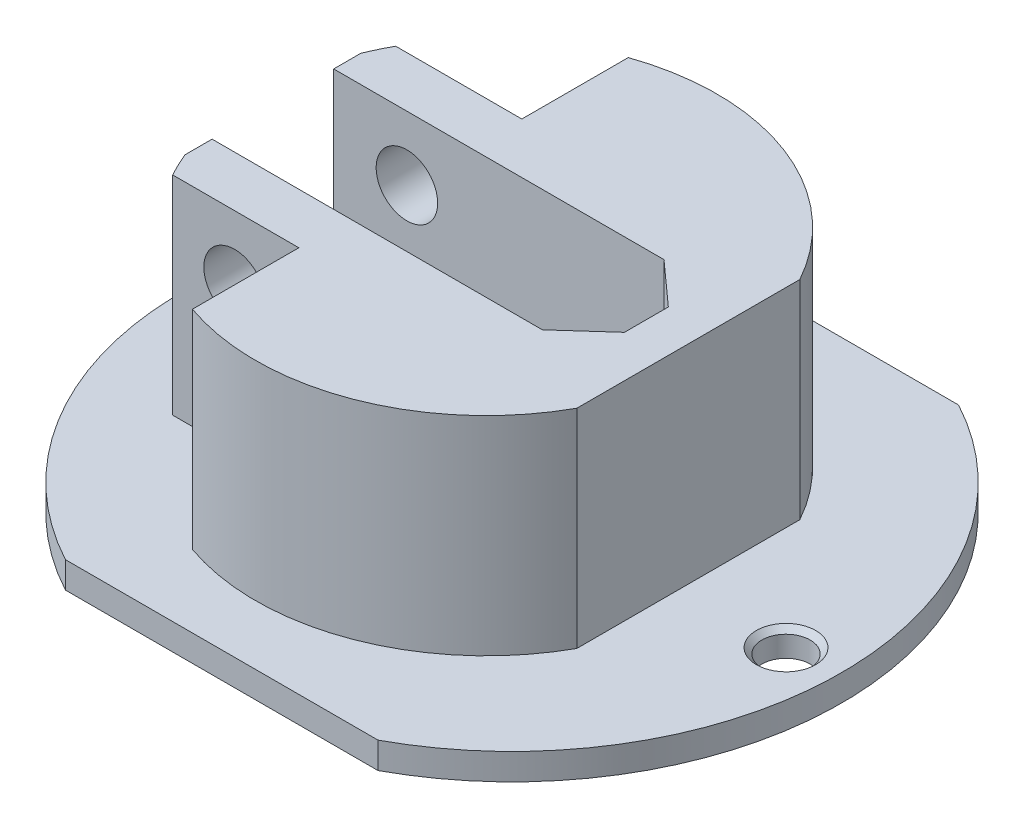
ISO-10303-21;
HEADER;
FILE_DESCRIPTION(('STEP AP214'),'2;1');
FILE_NAME('part.step','',(''),(''),'','','');
FILE_SCHEMA(('AUTOMOTIVE_DESIGN { 1 0 10303 214 1 1 1 1 }'));
ENDSEC;
DATA;
#1=APPLICATION_CONTEXT('core data for automotive mechanical design processes');
#2=APPLICATION_PROTOCOL_DEFINITION('international standard','automotive_design',2000,#1);
#3=PRODUCT_CONTEXT('',#1,'mechanical');
#4=PRODUCT('Part','Part','',(#3));
#5=PRODUCT_RELATED_PRODUCT_CATEGORY('part','',(#4));
#6=PRODUCT_DEFINITION_FORMATION('','',#4);
#7=PRODUCT_DEFINITION_CONTEXT('part definition',#1,'design');
#8=PRODUCT_DEFINITION('design','',#6,#7);
#9=PRODUCT_DEFINITION_SHAPE('','',#8);
#10=(LENGTH_UNIT() NAMED_UNIT(*) SI_UNIT(.MILLI.,.METRE.));
#11=(NAMED_UNIT(*) PLANE_ANGLE_UNIT() SI_UNIT($,.RADIAN.));
#12=(NAMED_UNIT(*) SI_UNIT($,.STERADIAN.) SOLID_ANGLE_UNIT());
#13=UNCERTAINTY_MEASURE_WITH_UNIT(LENGTH_MEASURE(1.E-05),#10,'distance_accuracy_value','');
#14=(GEOMETRIC_REPRESENTATION_CONTEXT(3) GLOBAL_UNCERTAINTY_ASSIGNED_CONTEXT((#13)) GLOBAL_UNIT_ASSIGNED_CONTEXT((#10,
#11,#12)) REPRESENTATION_CONTEXT('',''));
#15=CARTESIAN_POINT('',(0.,0.,0.));
#16=DIRECTION('',(0.,0.,1.));
#17=DIRECTION('',(1.,0.,0.));
#18=AXIS2_PLACEMENT_3D('',#15,#16,#17);
#19=CARTESIAN_POINT('',(7.74345813862928,16.,4.1));
#20=DIRECTION('',(0.,-1.,0.));
#21=DIRECTION('',(0.,0.,-1.));
#22=AXIS2_PLACEMENT_3D('',#19,#20,#21);
#23=CYLINDRICAL_SURFACE('',#22,15.75);
#24=DIRECTION('',(0.,-1.,0.));
#25=VECTOR('',#24,1.);
#26=CARTESIAN_POINT('',(21.5330945154003,16.,-3.50975877386623));
#27=LINE('',#26,#25);
#28=CARTESIAN_POINT('',(21.5330945154003,16.,-3.50975877386623));
#29=VERTEX_POINT('',#28);
#30=CARTESIAN_POINT('',(21.5330945154003,1.8,-3.50975877386623));
#31=VERTEX_POINT('',#30);
#32=EDGE_CURVE('E281',#29,#31,#27,.T.);
#33=ORIENTED_EDGE('',*,*,#32,.T.);
#34=CARTESIAN_POINT('',(7.74345813862928,1.8,4.1));
#35=DIRECTION('',(0.,1.,0.));
#36=DIRECTION('',(0.,0.,1.));
#37=AXIS2_PLACEMENT_3D('',#34,#35,#36);
#38=CIRCLE('',#37,15.75);
#39=CARTESIAN_POINT('',(2.5617476099898,1.8,-10.7732100098596));
#40=VERTEX_POINT('',#39);
#41=EDGE_CURVE('E60',#31,#40,#38,.T.);
#42=ORIENTED_EDGE('',*,*,#41,.T.);
#43=DIRECTION('',(0.,-1.,0.));
#44=VECTOR('',#43,1.);
#45=CARTESIAN_POINT('',(2.5617476099898,16.,-10.7732100098596));
#46=LINE('',#45,#44);
#47=CARTESIAN_POINT('',(2.5617476099898,16.,-10.7732100098596));
#48=VERTEX_POINT('',#47);
#49=EDGE_CURVE('E45',#48,#40,#46,.T.);
#50=ORIENTED_EDGE('',*,*,#49,.F.);
#51=CARTESIAN_POINT('',(7.74345813862928,16.,4.1));
#52=DIRECTION('',(0.,1.,0.));
#53=DIRECTION('',(0.,0.,1.));
#54=AXIS2_PLACEMENT_3D('',#51,#52,#53);
#55=CIRCLE('',#54,15.75);
#56=EDGE_CURVE('E244',#29,#48,#55,.T.);
#57=ORIENTED_EDGE('',*,*,#56,.F.);
#58=EDGE_LOOP('',(#33,#42,#50,#57));
#59=FACE_BOUND('',#58,.T.);
#60=ADVANCED_FACE('F37',(#59),#23,.T.);
#61=CARTESIAN_POINT('',(2.5617476099898,16.,-3.50975877386623));
#62=DIRECTION('',(1.,0.,0.));
#63=DIRECTION('',(0.,0.,-1.));
#64=AXIS2_PLACEMENT_3D('',#61,#62,#63);
#65=PLANE('',#64);
#66=ORIENTED_EDGE('',*,*,#49,.T.);
#67=DIRECTION('',(0.,0.,1.));
#68=VECTOR('',#67,1.);
#69=CARTESIAN_POINT('',(2.5617476099898,1.8,-3.50975877386623));
#70=LINE('',#69,#68);
#71=CARTESIAN_POINT('',(2.5617476099898,1.8,-3.50975877386623));
#72=VERTEX_POINT('',#71);
#73=EDGE_CURVE('E240',#40,#72,#70,.T.);
#74=ORIENTED_EDGE('',*,*,#73,.T.);
#75=DIRECTION('',(0.,-1.,0.));
#76=VECTOR('',#75,1.);
#77=CARTESIAN_POINT('',(2.5617476099898,16.,-3.50975877386623));
#78=LINE('',#77,#76);
#79=CARTESIAN_POINT('',(2.5617476099898,16.,-3.50975877386623));
#80=VERTEX_POINT('',#79);
#81=EDGE_CURVE('E321',#80,#72,#78,.T.);
#82=ORIENTED_EDGE('',*,*,#81,.F.);
#83=DIRECTION('',(0.,0.,1.));
#84=VECTOR('',#83,1.);
#85=CARTESIAN_POINT('',(2.5617476099898,16.,-9.29598357707961));
#86=LINE('',#85,#84);
#87=EDGE_CURVE('E247',#48,#80,#86,.T.);
#88=ORIENTED_EDGE('',*,*,#87,.F.);
#89=EDGE_LOOP('',(#66,#74,#82,#88));
#90=FACE_BOUND('',#89,.T.);
#91=ADVANCED_FACE('F327',(#90),#65,.F.);
#92=CARTESIAN_POINT('',(-4.4382523900102,16.,-3.50975877386623));
#93=DIRECTION('',(0.,0.,1.));
#94=DIRECTION('',(1.,0.,0.));
#95=AXIS2_PLACEMENT_3D('',#92,#93,#94);
#96=PLANE('',#95);
#97=CARTESIAN_POINT('',(-1.82378765132546,11.6161721166661,-3.50975877386623));
#98=DIRECTION('',(0.,0.,1.));
#99=DIRECTION('',(1.,0.,0.));
#100=AXIS2_PLACEMENT_3D('',#97,#98,#99);
#101=CIRCLE('',#100,2.09999999999999);
#102=CARTESIAN_POINT('',(0.276212348674535,11.6161721166661,-3.50975877386623));
#103=VERTEX_POINT('',#102);
#104=EDGE_CURVE('E404',#103,#103,#101,.T.);
#105=ORIENTED_EDGE('',*,*,#104,.T.);
#106=EDGE_LOOP('',(#105));
#107=FACE_BOUND('',#106,.T.);
#108=ORIENTED_EDGE('',*,*,#81,.T.);
#109=DIRECTION('',(-1.,0.,0.));
#110=VECTOR('',#109,1.);
#111=CARTESIAN_POINT('',(-4.4382523900102,1.8,-3.50975877386623));
#112=LINE('',#111,#110);
#113=CARTESIAN_POINT('',(-6.04617823814172,1.8,-3.50975877386623));
#114=VERTEX_POINT('',#113);
#115=EDGE_CURVE('E237',#72,#114,#112,.T.);
#116=ORIENTED_EDGE('',*,*,#115,.T.);
#117=DIRECTION('',(0.,-1.,0.));
#118=VECTOR('',#117,1.);
#119=CARTESIAN_POINT('',(-6.04617823814172,16.,-3.50975877386623));
#120=LINE('',#119,#118);
#121=CARTESIAN_POINT('',(-6.04617823814172,16.,-3.50975877386623));
#122=VERTEX_POINT('',#121);
#123=EDGE_CURVE('E318',#122,#114,#120,.T.);
#124=ORIENTED_EDGE('',*,*,#123,.F.);
#125=DIRECTION('',(-1.,0.,0.));
#126=VECTOR('',#125,1.);
#127=CARTESIAN_POINT('',(2.5617476099898,16.,-3.50975877386623));
#128=LINE('',#127,#126);
#129=EDGE_CURVE('E249',#80,#122,#128,.T.);
#130=ORIENTED_EDGE('',*,*,#129,.F.);
#131=EDGE_LOOP('',(#108,#116,#124,#130));
#132=FACE_BOUND('',#131,.T.);
#133=ADVANCED_FACE('F481',(#107,#132),#96,.F.);
#134=CARTESIAN_POINT('',(7.74345813862928,16.,4.1));
#135=DIRECTION('',(0.,-1.,0.));
#136=DIRECTION('',(0.,0.,-1.));
#137=AXIS2_PLACEMENT_3D('',#134,#135,#136);
#138=CYLINDRICAL_SURFACE('',#137,15.75);
#139=ORIENTED_EDGE('',*,*,#123,.T.);
#140=CARTESIAN_POINT('',(7.74345813862928,1.8,4.1));
#141=DIRECTION('',(0.,1.,0.));
#142=DIRECTION('',(0.,0.,1.));
#143=AXIS2_PLACEMENT_3D('',#140,#141,#142);
#144=CIRCLE('',#143,15.75);
#145=CARTESIAN_POINT('',(-6.81890774058142,1.8,-1.9));
#146=VERTEX_POINT('',#145);
#147=EDGE_CURVE('E234',#114,#146,#144,.T.);
#148=ORIENTED_EDGE('',*,*,#147,.T.);
#149=DIRECTION('',(0.,-1.,0.));
#150=VECTOR('',#149,1.);
#151=CARTESIAN_POINT('',(-6.81890774058142,16.,-1.9));
#152=LINE('',#151,#150);
#153=CARTESIAN_POINT('',(-6.81890774058142,16.,-1.9));
#154=VERTEX_POINT('',#153);
#155=EDGE_CURVE('E315',#154,#146,#152,.T.);
#156=ORIENTED_EDGE('',*,*,#155,.F.);
#157=CARTESIAN_POINT('',(7.74345813862928,16.,4.1));
#158=DIRECTION('',(0.,1.,0.));
#159=DIRECTION('',(0.,0.,1.));
#160=AXIS2_PLACEMENT_3D('',#157,#158,#159);
#161=CIRCLE('',#160,15.75);
#162=EDGE_CURVE('E251',#122,#154,#161,.T.);
#163=ORIENTED_EDGE('',*,*,#162,.F.);
#164=EDGE_LOOP('',(#139,#148,#156,#163));
#165=FACE_BOUND('',#164,.T.);
#166=ADVANCED_FACE('F485',(#165),#138,.T.);
#167=CARTESIAN_POINT('',(-6.81890774058142,16.,-1.9));
#168=DIRECTION('',(1.,0.,0.));
#169=DIRECTION('',(0.,0.,-1.));
#170=AXIS2_PLACEMENT_3D('',#167,#168,#169);
#171=PLANE('',#170);
#172=ORIENTED_EDGE('',*,*,#155,.T.);
#173=DIRECTION('',(0.,0.,1.));
#174=VECTOR('',#173,1.);
#175=CARTESIAN_POINT('',(-6.81890774058142,1.8,-1.9));
#176=LINE('',#175,#174);
#177=CARTESIAN_POINT('',(-6.81890774058142,1.8,-0.0499999999999971));
#178=VERTEX_POINT('',#177);
#179=EDGE_CURVE('E226',#146,#178,#176,.T.);
#180=ORIENTED_EDGE('',*,*,#179,.T.);
#181=DIRECTION('',(0.,-1.,0.));
#182=VECTOR('',#181,1.);
#183=CARTESIAN_POINT('',(-6.81890774058142,16.,-0.0499999999999973));
#184=LINE('',#183,#182);
#185=CARTESIAN_POINT('',(-6.81890774058142,16.,-0.0499999999999973));
#186=VERTEX_POINT('',#185);
#187=EDGE_CURVE('E312',#186,#178,#184,.T.);
#188=ORIENTED_EDGE('',*,*,#187,.F.);
#189=DIRECTION('',(0.,0.,1.));
#190=VECTOR('',#189,1.);
#191=CARTESIAN_POINT('',(-6.81890774058142,16.,-1.9));
#192=LINE('',#191,#190);
#193=EDGE_CURVE('E253',#154,#186,#192,.T.);
#194=ORIENTED_EDGE('',*,*,#193,.F.);
#195=EDGE_LOOP('',(#172,#180,#188,#194));
#196=FACE_BOUND('',#195,.T.);
#197=ADVANCED_FACE('F491',(#196),#171,.F.);
#198=CARTESIAN_POINT('',(15.7777091923277,16.,-0.05));
#199=DIRECTION('',(0.,0.,-1.));
#200=DIRECTION('',(-1.,0.,0.));
#201=AXIS2_PLACEMENT_3D('',#198,#199,#200);
#202=PLANE('',#201);
#203=CARTESIAN_POINT('',(-1.82378765132546,11.6161721166661,-0.049999999999998));
#204=DIRECTION('',(0.,0.,-1.));
#205=DIRECTION('',(-1.,0.,0.));
#206=AXIS2_PLACEMENT_3D('',#203,#204,#205);
#207=CIRCLE('',#206,2.09999999999999);
#208=CARTESIAN_POINT('',(-3.92378765132545,11.6161721166661,-0.0499999999999977));
#209=VERTEX_POINT('',#208);
#210=EDGE_CURVE('E398',#209,#209,#207,.T.);
#211=ORIENTED_EDGE('',*,*,#210,.T.);
#212=EDGE_LOOP('',(#211));
#213=FACE_BOUND('',#212,.T.);
#214=ORIENTED_EDGE('',*,*,#187,.T.);
#215=DIRECTION('',(1.,0.,0.));
#216=VECTOR('',#215,1.);
#217=CARTESIAN_POINT('',(15.7777091923277,1.8,-0.05));
#218=LINE('',#217,#216);
#219=CARTESIAN_POINT('',(2.82126674727697,1.8,-0.0499999999999984));
#220=VERTEX_POINT('',#219);
#221=EDGE_CURVE('E224',#178,#220,#218,.T.);
#222=ORIENTED_EDGE('',*,*,#221,.T.);
#223=DIRECTION('',(0.,1.,0.));
#224=VECTOR('',#223,1.);
#225=CARTESIAN_POINT('',(2.82126674727697,-0.001000000000001,-0.0499999999999973));
#226=LINE('',#225,#224);
#227=CARTESIAN_POINT('',(2.82126674727697,0.,-0.0499999999999973));
#228=VERTEX_POINT('',#227);
#229=EDGE_CURVE('E204',#228,#220,#226,.T.);
#230=ORIENTED_EDGE('',*,*,#229,.F.);
#231=DIRECTION('',(1.,0.,0.));
#232=VECTOR('',#231,1.);
#233=CARTESIAN_POINT('',(2.82126674727697,0.,-0.0499999999999973));
#234=LINE('',#233,#232);
#235=CARTESIAN_POINT('',(15.7777091923277,0.,-0.05));
#236=VERTEX_POINT('',#235);
#237=EDGE_CURVE('E389',#228,#236,#234,.T.);
#238=ORIENTED_EDGE('',*,*,#237,.T.);
#239=DIRECTION('',(0.,-1.,0.));
#240=VECTOR('',#239,1.);
#241=CARTESIAN_POINT('',(15.7777091923277,16.,-0.05));
#242=LINE('',#241,#240);
#243=CARTESIAN_POINT('',(15.7777091923277,16.,-0.05));
#244=VERTEX_POINT('',#243);
#245=EDGE_CURVE('E310',#244,#236,#242,.T.);
#246=ORIENTED_EDGE('',*,*,#245,.F.);
#247=DIRECTION('',(1.,0.,0.));
#248=VECTOR('',#247,1.);
#249=CARTESIAN_POINT('',(-6.81890774058142,16.,-0.0499999999999973));
#250=LINE('',#249,#248);
#251=EDGE_CURVE('E255',#186,#244,#250,.T.);
#252=ORIENTED_EDGE('',*,*,#251,.F.);
#253=EDGE_LOOP('',(#214,#222,#230,#238,#246,#252));
#254=FACE_BOUND('',#253,.T.);
#255=ADVANCED_FACE('F495',(#213,#254),#202,.F.);
#256=CARTESIAN_POINT('',(15.7777091923277,16.,-0.05));
#257=DIRECTION('',(1.,0.,0.));
#258=DIRECTION('',(0.,0.,-1.));
#259=AXIS2_PLACEMENT_3D('',#256,#257,#258);
#260=PLANE('',#259);
#261=ORIENTED_EDGE('',*,*,#245,.T.);
#262=DIRECTION('',(0.,0.,1.));
#263=VECTOR('',#262,1.);
#264=CARTESIAN_POINT('',(15.7777091923277,0.,-0.05));
#265=LINE('',#264,#263);
#266=CARTESIAN_POINT('',(15.7777091923277,0.,0.));
#267=VERTEX_POINT('',#266);
#268=EDGE_CURVE('E820',#236,#267,#265,.T.);
#269=ORIENTED_EDGE('',*,*,#268,.T.);
#270=DIRECTION('',(0.,-1.,0.));
#271=VECTOR('',#270,1.);
#272=CARTESIAN_POINT('',(15.7777091923277,16.,0.));
#273=LINE('',#272,#271);
#274=CARTESIAN_POINT('',(15.7777091923277,16.,0.));
#275=VERTEX_POINT('',#274);
#276=EDGE_CURVE('E52',#275,#267,#273,.T.);
#277=ORIENTED_EDGE('',*,*,#276,.F.);
#278=DIRECTION('',(0.,0.,1.));
#279=VECTOR('',#278,1.);
#280=CARTESIAN_POINT('',(15.7777091923277,16.,-0.05));
#281=LINE('',#280,#279);
#282=EDGE_CURVE('E257',#244,#275,#281,.T.);
#283=ORIENTED_EDGE('',*,*,#282,.F.);
#284=EDGE_LOOP('',(#261,#269,#277,#283));
#285=FACE_BOUND('',#284,.T.);
#286=ADVANCED_FACE('F499',(#285),#260,.F.);
#287=CARTESIAN_POINT('',(18.671266747277,16.,2.59988935845273));
#288=DIRECTION('',(0.668352020167797,0.,-0.743845129807022));
#289=DIRECTION('',(-0.743845129807022,0.,-0.668352020167797));
#290=AXIS2_PLACEMENT_3D('',#287,#288,#289);
#291=PLANE('',#290);
#292=ORIENTED_EDGE('',*,*,#276,.T.);
#293=DIRECTION('',(0.743845129807022,0.,0.668352020167797));
#294=VECTOR('',#293,1.);
#295=CARTESIAN_POINT('',(15.7777091923277,0.,0.));
#296=LINE('',#295,#294);
#297=CARTESIAN_POINT('',(18.671266747277,0.,2.59988935845273));
#298=VERTEX_POINT('',#297);
#299=EDGE_CURVE('E217',#267,#298,#296,.T.);
#300=ORIENTED_EDGE('',*,*,#299,.T.);
#301=DIRECTION('',(0.,-1.,0.));
#302=VECTOR('',#301,1.);
#303=CARTESIAN_POINT('',(18.671266747277,16.,2.59988935845273));
#304=LINE('',#303,#302);
#305=CARTESIAN_POINT('',(18.671266747277,16.,2.59988935845273));
#306=VERTEX_POINT('',#305);
#307=EDGE_CURVE('E307',#306,#298,#304,.T.);
#308=ORIENTED_EDGE('',*,*,#307,.F.);
#309=DIRECTION('',(0.743845129807022,0.,0.668352020167797));
#310=VECTOR('',#309,1.);
#311=CARTESIAN_POINT('',(18.671266747277,16.,2.59988935845273));
#312=LINE('',#311,#310);
#313=EDGE_CURVE('E259',#275,#306,#312,.T.);
#314=ORIENTED_EDGE('',*,*,#313,.F.);
#315=EDGE_LOOP('',(#292,#300,#308,#314));
#316=FACE_BOUND('',#315,.T.);
#317=ADVANCED_FACE('F503',(#316),#291,.F.);
#318=CARTESIAN_POINT('',(18.671266747277,16.,2.59988935845273));
#319=DIRECTION('',(1.,0.,0.));
#320=DIRECTION('',(0.,0.,-1.));
#321=AXIS2_PLACEMENT_3D('',#318,#319,#320);
#322=PLANE('',#321);
#323=ORIENTED_EDGE('',*,*,#307,.T.);
#324=DIRECTION('',(0.,0.,1.));
#325=VECTOR('',#324,1.);
#326=CARTESIAN_POINT('',(18.671266747277,0.,2.59988935845273));
#327=LINE('',#326,#325);
#328=CARTESIAN_POINT('',(18.671266747277,0.,5.59988935845273));
#329=VERTEX_POINT('',#328);
#330=EDGE_CURVE('E207',#298,#329,#327,.T.);
#331=ORIENTED_EDGE('',*,*,#330,.T.);
#332=DIRECTION('',(0.,-1.,0.));
#333=VECTOR('',#332,1.);
#334=CARTESIAN_POINT('',(18.671266747277,16.,5.59988935845273));
#335=LINE('',#334,#333);
#336=CARTESIAN_POINT('',(18.671266747277,16.,5.59988935845273));
#337=VERTEX_POINT('',#336);
#338=EDGE_CURVE('E305',#337,#329,#335,.T.);
#339=ORIENTED_EDGE('',*,*,#338,.F.);
#340=DIRECTION('',(0.,0.,1.));
#341=VECTOR('',#340,1.);
#342=CARTESIAN_POINT('',(18.671266747277,16.,2.59988935845273));
#343=LINE('',#342,#341);
#344=EDGE_CURVE('E261',#306,#337,#343,.T.);
#345=ORIENTED_EDGE('',*,*,#344,.F.);
#346=EDGE_LOOP('',(#323,#331,#339,#345));
#347=FACE_BOUND('',#346,.T.);
#348=ADVANCED_FACE('F507',(#347),#322,.F.);
#349=CARTESIAN_POINT('',(18.671266747277,16.,5.59988935845273));
#350=DIRECTION('',(0.668352020167792,0.,0.743845129807026));
#351=DIRECTION('',(0.743845129807026,0.,-0.668352020167792));
#352=AXIS2_PLACEMENT_3D('',#349,#350,#351);
#353=PLANE('',#352);
#354=ORIENTED_EDGE('',*,*,#338,.T.);
#355=DIRECTION('',(-0.743845129807026,0.,0.668352020167792));
#356=VECTOR('',#355,1.);
#357=CARTESIAN_POINT('',(18.671266747277,0.,5.59988935845273));
#358=LINE('',#357,#356);
#359=CARTESIAN_POINT('',(15.7777091923276,0.,8.19977871690544));
#360=VERTEX_POINT('',#359);
#361=EDGE_CURVE('E382',#329,#360,#358,.T.);
#362=ORIENTED_EDGE('',*,*,#361,.T.);
#363=DIRECTION('',(0.,-1.,0.));
#364=VECTOR('',#363,1.);
#365=CARTESIAN_POINT('',(15.7777091923276,16.,8.19977871690544));
#366=LINE('',#365,#364);
#367=CARTESIAN_POINT('',(15.7777091923276,16.,8.19977871690544));
#368=VERTEX_POINT('',#367);
#369=EDGE_CURVE('E303',#368,#360,#366,.T.);
#370=ORIENTED_EDGE('',*,*,#369,.F.);
#371=DIRECTION('',(-0.743845129807026,0.,0.668352020167792));
#372=VECTOR('',#371,1.);
#373=CARTESIAN_POINT('',(18.671266747277,16.,5.59988935845273));
#374=LINE('',#373,#372);
#375=EDGE_CURVE('E263',#337,#368,#374,.T.);
#376=ORIENTED_EDGE('',*,*,#375,.F.);
#377=EDGE_LOOP('',(#354,#362,#370,#376));
#378=FACE_BOUND('',#377,.T.);
#379=ADVANCED_FACE('F510',(#378),#353,.F.);
#380=CARTESIAN_POINT('',(15.7777091923276,16.,8.19977871690544));
#381=DIRECTION('',(1.,0.,0.));
#382=DIRECTION('',(0.,0.,-1.));
#383=AXIS2_PLACEMENT_3D('',#380,#381,#382);
#384=PLANE('',#383);
#385=ORIENTED_EDGE('',*,*,#369,.T.);
#386=DIRECTION('',(0.,0.,1.));
#387=VECTOR('',#386,1.);
#388=CARTESIAN_POINT('',(15.7777091923276,0.,8.19977871690544));
#389=LINE('',#388,#387);
#390=CARTESIAN_POINT('',(15.7777091923276,0.,8.25));
#391=VERTEX_POINT('',#390);
#392=EDGE_CURVE('E376',#360,#391,#389,.T.);
#393=ORIENTED_EDGE('',*,*,#392,.T.);
#394=DIRECTION('',(0.,-1.,0.));
#395=VECTOR('',#394,1.);
#396=CARTESIAN_POINT('',(15.7777091923276,16.,8.25));
#397=LINE('',#396,#395);
#398=CARTESIAN_POINT('',(15.7777091923276,16.,8.25));
#399=VERTEX_POINT('',#398);
#400=EDGE_CURVE('E301',#399,#391,#397,.T.);
#401=ORIENTED_EDGE('',*,*,#400,.F.);
#402=DIRECTION('',(0.,0.,1.));
#403=VECTOR('',#402,1.);
#404=CARTESIAN_POINT('',(15.7777091923276,16.,8.19977871690544));
#405=LINE('',#404,#403);
#406=EDGE_CURVE('E265',#368,#399,#405,.T.);
#407=ORIENTED_EDGE('',*,*,#406,.F.);
#408=EDGE_LOOP('',(#385,#393,#401,#407));
#409=FACE_BOUND('',#408,.T.);
#410=ADVANCED_FACE('F377',(#409),#384,.F.);
#411=CARTESIAN_POINT('',(-6.81890774058142,16.,8.25));
#412=DIRECTION('',(0.,0.,1.));
#413=DIRECTION('',(1.,0.,0.));
#414=AXIS2_PLACEMENT_3D('',#411,#412,#413);
#415=PLANE('',#414);
#416=CARTESIAN_POINT('',(-1.82378765132546,11.6161721166661,8.25));
#417=DIRECTION('',(0.,0.,1.));
#418=DIRECTION('',(1.,0.,0.));
#419=AXIS2_PLACEMENT_3D('',#416,#417,#418);
#420=CIRCLE('',#419,2.09999999999999);
#421=CARTESIAN_POINT('',(0.276212348674535,11.6161721166661,8.25));
#422=VERTEX_POINT('',#421);
#423=EDGE_CURVE('E40',#422,#422,#420,.T.);
#424=ORIENTED_EDGE('',*,*,#423,.T.);
#425=EDGE_LOOP('',(#424));
#426=FACE_BOUND('',#425,.T.);
#427=ORIENTED_EDGE('',*,*,#400,.T.);
#428=DIRECTION('',(-1.,0.,0.));
#429=VECTOR('',#428,1.);
#430=CARTESIAN_POINT('',(15.7777091923276,0.,8.25));
#431=LINE('',#430,#429);
#432=CARTESIAN_POINT('',(2.82126674727697,0.,8.25));
#433=VERTEX_POINT('',#432);
#434=EDGE_CURVE('E215',#391,#433,#431,.T.);
#435=ORIENTED_EDGE('',*,*,#434,.T.);
#436=DIRECTION('',(0.,1.,0.));
#437=VECTOR('',#436,1.);
#438=CARTESIAN_POINT('',(2.82126674727697,-0.001000000000001,8.25));
#439=LINE('',#438,#437);
#440=CARTESIAN_POINT('',(2.82126674727697,1.8,8.25));
#441=VERTEX_POINT('',#440);
#442=EDGE_CURVE('E202',#433,#441,#439,.T.);
#443=ORIENTED_EDGE('',*,*,#442,.T.);
#444=DIRECTION('',(-1.,0.,0.));
#445=VECTOR('',#444,1.);
#446=CARTESIAN_POINT('',(-6.81890774058142,1.8,8.25));
#447=LINE('',#446,#445);
#448=CARTESIAN_POINT('',(-6.81890774058142,1.8,8.25));
#449=VERTEX_POINT('',#448);
#450=EDGE_CURVE('E212',#441,#449,#447,.T.);
#451=ORIENTED_EDGE('',*,*,#450,.T.);
#452=DIRECTION('',(0.,-1.,0.));
#453=VECTOR('',#452,1.);
#454=CARTESIAN_POINT('',(-6.81890774058142,16.,8.25));
#455=LINE('',#454,#453);
#456=CARTESIAN_POINT('',(-6.81890774058142,16.,8.25));
#457=VERTEX_POINT('',#456);
#458=EDGE_CURVE('E299',#457,#449,#455,.T.);
#459=ORIENTED_EDGE('',*,*,#458,.F.);
#460=DIRECTION('',(-1.,0.,0.));
#461=VECTOR('',#460,1.);
#462=CARTESIAN_POINT('',(15.7777091923276,16.,8.25));
#463=LINE('',#462,#461);
#464=EDGE_CURVE('E267',#399,#457,#463,.T.);
#465=ORIENTED_EDGE('',*,*,#464,.F.);
#466=EDGE_LOOP('',(#427,#435,#443,#451,#459,#465));
#467=FACE_BOUND('',#466,.T.);
#468=ADVANCED_FACE('F210',(#426,#467),#415,.F.);
#469=CARTESIAN_POINT('',(-6.81890774058142,16.,10.1));
#470=DIRECTION('',(1.,0.,0.));
#471=DIRECTION('',(0.,0.,-1.));
#472=AXIS2_PLACEMENT_3D('',#469,#470,#471);
#473=PLANE('',#472);
#474=ORIENTED_EDGE('',*,*,#458,.T.);
#475=DIRECTION('',(0.,0.,1.));
#476=VECTOR('',#475,1.);
#477=CARTESIAN_POINT('',(-6.81890774058142,1.8,10.1));
#478=LINE('',#477,#476);
#479=CARTESIAN_POINT('',(-6.81890774058142,1.8,10.1));
#480=VERTEX_POINT('',#479);
#481=EDGE_CURVE('E222',#449,#480,#478,.T.);
#482=ORIENTED_EDGE('',*,*,#481,.T.);
#483=DIRECTION('',(0.,-1.,0.));
#484=VECTOR('',#483,1.);
#485=CARTESIAN_POINT('',(-6.81890774058142,16.,10.1));
#486=LINE('',#485,#484);
#487=CARTESIAN_POINT('',(-6.81890774058142,16.,10.1));
#488=VERTEX_POINT('',#487);
#489=EDGE_CURVE('E296',#488,#480,#486,.T.);
#490=ORIENTED_EDGE('',*,*,#489,.F.);
#491=DIRECTION('',(0.,0.,1.));
#492=VECTOR('',#491,1.);
#493=CARTESIAN_POINT('',(-6.81890774058142,16.,10.1));
#494=LINE('',#493,#492);
#495=EDGE_CURVE('E269',#457,#488,#494,.T.);
#496=ORIENTED_EDGE('',*,*,#495,.F.);
#497=EDGE_LOOP('',(#474,#482,#490,#496));
#498=FACE_BOUND('',#497,.T.);
#499=ADVANCED_FACE('F370',(#498),#473,.F.);
#500=CARTESIAN_POINT('',(7.74345813862928,16.,4.1));
#501=DIRECTION('',(0.,-1.,0.));
#502=DIRECTION('',(0.,0.,-1.));
#503=AXIS2_PLACEMENT_3D('',#500,#501,#502);
#504=CYLINDRICAL_SURFACE('',#503,15.75);
#505=ORIENTED_EDGE('',*,*,#489,.T.);
#506=CARTESIAN_POINT('',(7.74345813862928,1.8,4.1));
#507=DIRECTION('',(0.,1.,0.));
#508=DIRECTION('',(0.,0.,1.));
#509=AXIS2_PLACEMENT_3D('',#506,#507,#508);
#510=CIRCLE('',#509,15.75);
#511=CARTESIAN_POINT('',(-6.04617823814172,1.8,11.7097587738662));
#512=VERTEX_POINT('',#511);
#513=EDGE_CURVE('E228',#480,#512,#510,.T.);
#514=ORIENTED_EDGE('',*,*,#513,.T.);
#515=DIRECTION('',(0.,-1.,0.));
#516=VECTOR('',#515,1.);
#517=CARTESIAN_POINT('',(-6.04617823814172,16.,11.7097587738662));
#518=LINE('',#517,#516);
#519=CARTESIAN_POINT('',(-6.04617823814172,16.,11.7097587738662));
#520=VERTEX_POINT('',#519);
#521=EDGE_CURVE('E293',#520,#512,#518,.T.);
#522=ORIENTED_EDGE('',*,*,#521,.F.);
#523=CARTESIAN_POINT('',(7.74345813862928,16.,4.1));
#524=DIRECTION('',(0.,1.,0.));
#525=DIRECTION('',(0.,0.,1.));
#526=AXIS2_PLACEMENT_3D('',#523,#524,#525);
#527=CIRCLE('',#526,15.75);
#528=EDGE_CURVE('E271',#488,#520,#527,.T.);
#529=ORIENTED_EDGE('',*,*,#528,.F.);
#530=EDGE_LOOP('',(#505,#514,#522,#529));
#531=FACE_BOUND('',#530,.T.);
#532=ADVANCED_FACE('F357',(#531),#504,.T.);
#533=CARTESIAN_POINT('',(-4.43825239001019,16.,11.7097587738662));
#534=DIRECTION('',(0.,0.,-1.));
#535=DIRECTION('',(-1.,0.,0.));
#536=AXIS2_PLACEMENT_3D('',#533,#534,#535);
#537=PLANE('',#536);
#538=CARTESIAN_POINT('',(-1.82378765132546,11.6161721166661,11.7097587738662));
#539=DIRECTION('',(0.,0.,-1.));
#540=DIRECTION('',(-1.,0.,0.));
#541=AXIS2_PLACEMENT_3D('',#538,#539,#540);
#542=CIRCLE('',#541,2.09999999999999);
#543=CARTESIAN_POINT('',(-3.92378765132545,11.6161721166661,11.7097587738662));
#544=VERTEX_POINT('',#543);
#545=EDGE_CURVE('E401',#544,#544,#542,.T.);
#546=ORIENTED_EDGE('',*,*,#545,.T.);
#547=EDGE_LOOP('',(#546));
#548=FACE_BOUND('',#547,.T.);
#549=ORIENTED_EDGE('',*,*,#521,.T.);
#550=DIRECTION('',(1.,0.,0.));
#551=VECTOR('',#550,1.);
#552=CARTESIAN_POINT('',(-4.43825239001019,1.8,11.7097587738662));
#553=LINE('',#552,#551);
#554=CARTESIAN_POINT('',(2.5617476099898,1.8,11.7097587738662));
#555=VERTEX_POINT('',#554);
#556=EDGE_CURVE('E346',#512,#555,#553,.T.);
#557=ORIENTED_EDGE('',*,*,#556,.T.);
#558=DIRECTION('',(0.,-1.,0.));
#559=VECTOR('',#558,1.);
#560=CARTESIAN_POINT('',(2.5617476099898,16.,11.7097587738662));
#561=LINE('',#560,#559);
#562=CARTESIAN_POINT('',(2.5617476099898,16.,11.7097587738662));
#563=VERTEX_POINT('',#562);
#564=EDGE_CURVE('E290',#563,#555,#561,.T.);
#565=ORIENTED_EDGE('',*,*,#564,.F.);
#566=DIRECTION('',(1.,0.,0.));
#567=VECTOR('',#566,1.);
#568=CARTESIAN_POINT('',(-4.43825239001019,16.,11.7097587738662));
#569=LINE('',#568,#567);
#570=EDGE_CURVE('E273',#520,#563,#569,.T.);
#571=ORIENTED_EDGE('',*,*,#570,.F.);
#572=EDGE_LOOP('',(#549,#557,#565,#571));
#573=FACE_BOUND('',#572,.T.);
#574=ADVANCED_FACE('F362',(#548,#573),#537,.F.);
#575=CARTESIAN_POINT('',(2.5617476099898,16.,17.4959835770796));
#576=DIRECTION('',(1.,0.,0.));
#577=DIRECTION('',(0.,0.,-1.));
#578=AXIS2_PLACEMENT_3D('',#575,#576,#577);
#579=PLANE('',#578);
#580=ORIENTED_EDGE('',*,*,#564,.T.);
#581=DIRECTION('',(0.,0.,1.));
#582=VECTOR('',#581,1.);
#583=CARTESIAN_POINT('',(2.5617476099898,1.8,17.4959835770796));
#584=LINE('',#583,#582);
#585=CARTESIAN_POINT('',(2.5617476099898,1.8,18.9732100098596));
#586=VERTEX_POINT('',#585);
#587=EDGE_CURVE('E343',#555,#586,#584,.T.);
#588=ORIENTED_EDGE('',*,*,#587,.T.);
#589=DIRECTION('',(0.,-1.,0.));
#590=VECTOR('',#589,1.);
#591=CARTESIAN_POINT('',(2.5617476099898,16.,18.9732100098596));
#592=LINE('',#591,#590);
#593=CARTESIAN_POINT('',(2.5617476099898,16.,18.9732100098596));
#594=VERTEX_POINT('',#593);
#595=EDGE_CURVE('E287',#594,#586,#592,.T.);
#596=ORIENTED_EDGE('',*,*,#595,.F.);
#597=DIRECTION('',(0.,0.,1.));
#598=VECTOR('',#597,1.);
#599=CARTESIAN_POINT('',(2.5617476099898,16.,11.7097587738662));
#600=LINE('',#599,#598);
#601=EDGE_CURVE('E275',#563,#594,#600,.T.);
#602=ORIENTED_EDGE('',*,*,#601,.F.);
#603=EDGE_LOOP('',(#580,#588,#596,#602));
#604=FACE_BOUND('',#603,.T.);
#605=ADVANCED_FACE('F526',(#604),#579,.F.);
#606=CARTESIAN_POINT('',(7.74345813862928,16.,4.1));
#607=DIRECTION('',(0.,-1.,0.));
#608=DIRECTION('',(0.,0.,-1.));
#609=AXIS2_PLACEMENT_3D('',#606,#607,#608);
#610=CYLINDRICAL_SURFACE('',#609,15.75);
#611=ORIENTED_EDGE('',*,*,#595,.T.);
#612=CARTESIAN_POINT('',(7.74345813862928,1.8,4.1));
#613=DIRECTION('',(0.,1.,0.));
#614=DIRECTION('',(0.,0.,1.));
#615=AXIS2_PLACEMENT_3D('',#612,#613,#614);
#616=CIRCLE('',#615,15.75);
#617=CARTESIAN_POINT('',(21.5330945154003,1.8,11.7097587738662));
#618=VERTEX_POINT('',#617);
#619=EDGE_CURVE('E337',#586,#618,#616,.T.);
#620=ORIENTED_EDGE('',*,*,#619,.T.);
#621=DIRECTION('',(0.,-1.,0.));
#622=VECTOR('',#621,1.);
#623=CARTESIAN_POINT('',(21.5330945154003,16.,11.7097587738662));
#624=LINE('',#623,#622);
#625=CARTESIAN_POINT('',(21.5330945154003,16.,11.7097587738662));
#626=VERTEX_POINT('',#625);
#627=EDGE_CURVE('E284',#626,#618,#624,.T.);
#628=ORIENTED_EDGE('',*,*,#627,.F.);
#629=CARTESIAN_POINT('',(7.74345813862928,16.,4.1));
#630=DIRECTION('',(0.,1.,0.));
#631=DIRECTION('',(0.,0.,1.));
#632=AXIS2_PLACEMENT_3D('',#629,#630,#631);
#633=CIRCLE('',#632,15.75);
#634=EDGE_CURVE('E277',#594,#626,#633,.T.);
#635=ORIENTED_EDGE('',*,*,#634,.F.);
#636=EDGE_LOOP('',(#611,#620,#628,#635));
#637=FACE_BOUND('',#636,.T.);
#638=ADVANCED_FACE('F340',(#637),#610,.T.);
#639=CARTESIAN_POINT('',(21.5330945154003,16.,-3.50975877386623));
#640=DIRECTION('',(-1.,0.,0.));
#641=DIRECTION('',(0.,0.,1.));
#642=AXIS2_PLACEMENT_3D('',#639,#640,#641);
#643=PLANE('',#642);
#644=ORIENTED_EDGE('',*,*,#627,.T.);
#645=DIRECTION('',(0.,0.,-1.));
#646=VECTOR('',#645,1.);
#647=CARTESIAN_POINT('',(21.5330945154003,1.8,-3.50975877386623));
#648=LINE('',#647,#646);
#649=EDGE_CURVE('E11',#618,#31,#648,.T.);
#650=ORIENTED_EDGE('',*,*,#649,.T.);
#651=ORIENTED_EDGE('',*,*,#32,.F.);
#652=DIRECTION('',(0.,0.,-1.));
#653=VECTOR('',#652,1.);
#654=CARTESIAN_POINT('',(21.5330945154003,16.,-3.50975877386623));
#655=LINE('',#654,#653);
#656=EDGE_CURVE('E279',#626,#29,#655,.T.);
#657=ORIENTED_EDGE('',*,*,#656,.F.);
#658=EDGE_LOOP('',(#644,#650,#651,#657));
#659=FACE_BOUND('',#658,.T.);
#660=ADVANCED_FACE('F334',(#659),#643,.F.);
#661=CARTESIAN_POINT('',(7.74345813862928,16.,4.1));
#662=DIRECTION('',(0.,1.,0.));
#663=DIRECTION('',(0.,0.,1.));
#664=AXIS2_PLACEMENT_3D('',#661,#662,#663);
#665=PLANE('',#664);
#666=ORIENTED_EDGE('',*,*,#56,.T.);
#667=ORIENTED_EDGE('',*,*,#87,.T.);
#668=ORIENTED_EDGE('',*,*,#129,.T.);
#669=ORIENTED_EDGE('',*,*,#162,.T.);
#670=ORIENTED_EDGE('',*,*,#193,.T.);
#671=ORIENTED_EDGE('',*,*,#251,.T.);
#672=ORIENTED_EDGE('',*,*,#282,.T.);
#673=ORIENTED_EDGE('',*,*,#313,.T.);
#674=ORIENTED_EDGE('',*,*,#344,.T.);
#675=ORIENTED_EDGE('',*,*,#375,.T.);
#676=ORIENTED_EDGE('',*,*,#406,.T.);
#677=ORIENTED_EDGE('',*,*,#464,.T.);
#678=ORIENTED_EDGE('',*,*,#495,.T.);
#679=ORIENTED_EDGE('',*,*,#528,.T.);
#680=ORIENTED_EDGE('',*,*,#570,.T.);
#681=ORIENTED_EDGE('',*,*,#601,.T.);
#682=ORIENTED_EDGE('',*,*,#634,.T.);
#683=ORIENTED_EDGE('',*,*,#656,.T.);
#684=EDGE_LOOP('',(#666,#667,#668,#669,#670,#671,#672,#673,#674,#675,#676,#677,#678,#679,#680,
#681,#682,#683));
#685=FACE_BOUND('',#684,.T.);
#686=ADVANCED_FACE('F366',(#685),#665,.T.);
#687=CARTESIAN_POINT('',(9.5,1.8,4.1));
#688=DIRECTION('',(0.,1.,0.));
#689=DIRECTION('',(0.,0.,1.));
#690=AXIS2_PLACEMENT_3D('',#687,#688,#689);
#691=PLANE('',#690);
#692=DIRECTION('',(0.,0.,-1.));
#693=VECTOR('',#692,1.);
#694=CARTESIAN_POINT('',(2.82126674727697,1.8,-0.0499999999999973));
#695=LINE('',#694,#693);
#696=EDGE_CURVE('E198',#441,#220,#695,.T.);
#697=ORIENTED_EDGE('',*,*,#696,.T.);
#698=ORIENTED_EDGE('',*,*,#221,.F.);
#699=ORIENTED_EDGE('',*,*,#179,.F.);
#700=ORIENTED_EDGE('',*,*,#147,.F.);
#701=ORIENTED_EDGE('',*,*,#115,.F.);
#702=ORIENTED_EDGE('',*,*,#73,.F.);
#703=ORIENTED_EDGE('',*,*,#41,.F.);
#704=ORIENTED_EDGE('',*,*,#649,.F.);
#705=ORIENTED_EDGE('',*,*,#619,.F.);
#706=ORIENTED_EDGE('',*,*,#587,.F.);
#707=ORIENTED_EDGE('',*,*,#556,.F.);
#708=ORIENTED_EDGE('',*,*,#513,.F.);
#709=ORIENTED_EDGE('',*,*,#481,.F.);
#710=ORIENTED_EDGE('',*,*,#450,.F.);
#711=EDGE_LOOP('',(#697,#698,#699,#700,#701,#702,#703,#704,#705,#706,#707,#708,#709,#710));
#712=FACE_BOUND('',#711,.T.);
#713=CARTESIAN_POINT('',(-9.38551563641675,1.8,4.46923168797503));
#714=DIRECTION('',(0.,1.,0.));
#715=DIRECTION('',(0.,0.,1.));
#716=AXIS2_PLACEMENT_3D('',#713,#714,#715);
#717=CIRCLE('',#716,2.025);
#718=CARTESIAN_POINT('',(-9.38551563641675,1.8,6.49423168797503));
#719=VERTEX_POINT('',#718);
#720=EDGE_CURVE('E407',#719,#719,#717,.T.);
#721=ORIENTED_EDGE('',*,*,#720,.F.);
#722=EDGE_LOOP('',(#721));
#723=FACE_BOUND('',#722,.T.);
#724=CARTESIAN_POINT('',(28.6207327791426,1.8,4.51846257970503));
#725=DIRECTION('',(0.,1.,0.));
#726=DIRECTION('',(0.,0.,1.));
#727=AXIS2_PLACEMENT_3D('',#724,#725,#726);
#728=CIRCLE('',#727,2.025);
#729=CARTESIAN_POINT('',(28.6207327791426,1.8,6.54346257970503));
#730=VERTEX_POINT('',#729);
#731=EDGE_CURVE('E416',#730,#730,#728,.T.);
#732=ORIENTED_EDGE('',*,*,#731,.F.);
#733=EDGE_LOOP('',(#732));
#734=FACE_BOUND('',#733,.T.);
#735=CARTESIAN_POINT('',(9.5,1.8,4.1));
#736=DIRECTION('',(0.,1.,0.));
#737=DIRECTION('',(0.,0.,1.));
#738=AXIS2_PLACEMENT_3D('',#735,#736,#737);
#739=CIRCLE('',#738,22.5);
#740=CARTESIAN_POINT('',(-1.16749426660317,1.8,-15.7104660740728));
#741=VERTEX_POINT('',#740);
#742=CARTESIAN_POINT('',(-1.16749426660315,1.8,23.9104660740728));
#743=VERTEX_POINT('',#742);
#744=EDGE_CURVE('E426',#741,#743,#739,.T.);
#745=ORIENTED_EDGE('',*,*,#744,.T.);
#746=DIRECTION('',(1.,0.,0.));
#747=VECTOR('',#746,1.);
#748=CARTESIAN_POINT('',(20.1674942666031,1.8,23.9104660740728));
#749=LINE('',#748,#747);
#750=CARTESIAN_POINT('',(20.1674942666031,1.8,23.9104660740728));
#751=VERTEX_POINT('',#750);
#752=EDGE_CURVE('E429',#743,#751,#749,.T.);
#753=ORIENTED_EDGE('',*,*,#752,.T.);
#754=CARTESIAN_POINT('',(9.5,1.8,4.1));
#755=DIRECTION('',(0.,1.,0.));
#756=DIRECTION('',(0.,0.,1.));
#757=AXIS2_PLACEMENT_3D('',#754,#755,#756);
#758=CIRCLE('',#757,22.5);
#759=CARTESIAN_POINT('',(20.1674942666031,1.8,-15.7104660740728));
#760=VERTEX_POINT('',#759);
#761=EDGE_CURVE('E432',#751,#760,#758,.T.);
#762=ORIENTED_EDGE('',*,*,#761,.T.);
#763=DIRECTION('',(-1.,0.,0.));
#764=VECTOR('',#763,1.);
#765=CARTESIAN_POINT('',(-1.16749426660317,1.8,-15.7104660740728));
#766=LINE('',#765,#764);
#767=EDGE_CURVE('E434',#760,#741,#766,.T.);
#768=ORIENTED_EDGE('',*,*,#767,.T.);
#769=EDGE_LOOP('',(#745,#753,#762,#768));
#770=FACE_BOUND('',#769,.T.);
#771=ADVANCED_FACE('F219',(#712,#723,#734,#770),#691,.T.);
#772=CARTESIAN_POINT('',(9.5,1.8,4.1));
#773=DIRECTION('',(0.,-1.,0.));
#774=DIRECTION('',(0.,0.,-1.));
#775=AXIS2_PLACEMENT_3D('',#772,#773,#774);
#776=CYLINDRICAL_SURFACE('',#775,22.5);
#777=CARTESIAN_POINT('',(9.5,0.,4.1));
#778=DIRECTION('',(0.,1.,0.));
#779=DIRECTION('',(0.,0.,1.));
#780=AXIS2_PLACEMENT_3D('',#777,#778,#779);
#781=CIRCLE('',#780,22.5);
#782=CARTESIAN_POINT('',(-1.16749426660317,0.,-15.7104660740728));
#783=VERTEX_POINT('',#782);
#784=CARTESIAN_POINT('',(-1.16749426660315,0.,23.9104660740728));
#785=VERTEX_POINT('',#784);
#786=EDGE_CURVE('E425',#783,#785,#781,.T.);
#787=ORIENTED_EDGE('',*,*,#786,.T.);
#788=DIRECTION('',(0.,-1.,0.));
#789=VECTOR('',#788,1.);
#790=CARTESIAN_POINT('',(-1.16749426660315,1.8,23.9104660740728));
#791=LINE('',#790,#789);
#792=EDGE_CURVE('E344',#743,#785,#791,.T.);
#793=ORIENTED_EDGE('',*,*,#792,.F.);
#794=ORIENTED_EDGE('',*,*,#744,.F.);
#795=DIRECTION('',(0.,-1.,0.));
#796=VECTOR('',#795,1.);
#797=CARTESIAN_POINT('',(-1.16749426660317,1.8,-15.7104660740728));
#798=LINE('',#797,#796);
#799=EDGE_CURVE('E436',#741,#783,#798,.T.);
#800=ORIENTED_EDGE('',*,*,#799,.T.);
#801=EDGE_LOOP('',(#787,#793,#794,#800));
#802=FACE_BOUND('',#801,.T.);
#803=ADVANCED_FACE('F465',(#802),#776,.T.);
#804=CARTESIAN_POINT('',(20.1674942666031,1.8,23.9104660740728));
#805=DIRECTION('',(0.,0.,-1.));
#806=DIRECTION('',(-1.,0.,0.));
#807=AXIS2_PLACEMENT_3D('',#804,#805,#806);
#808=PLANE('',#807);
#809=DIRECTION('',(1.,0.,0.));
#810=VECTOR('',#809,1.);
#811=CARTESIAN_POINT('',(20.1674942666031,0.,23.9104660740728));
#812=LINE('',#811,#810);
#813=CARTESIAN_POINT('',(20.1674942666031,0.,23.9104660740728));
#814=VERTEX_POINT('',#813);
#815=EDGE_CURVE('E439',#785,#814,#812,.T.);
#816=ORIENTED_EDGE('',*,*,#815,.T.);
#817=DIRECTION('',(0.,-1.,0.));
#818=VECTOR('',#817,1.);
#819=CARTESIAN_POINT('',(20.1674942666031,1.8,23.9104660740728));
#820=LINE('',#819,#818);
#821=EDGE_CURVE('E349',#751,#814,#820,.T.);
#822=ORIENTED_EDGE('',*,*,#821,.F.);
#823=ORIENTED_EDGE('',*,*,#752,.F.);
#824=ORIENTED_EDGE('',*,*,#792,.T.);
#825=EDGE_LOOP('',(#816,#822,#823,#824));
#826=FACE_BOUND('',#825,.T.);
#827=ADVANCED_FACE('F468',(#826),#808,.F.);
#828=CARTESIAN_POINT('',(9.5,1.8,4.1));
#829=DIRECTION('',(0.,-1.,0.));
#830=DIRECTION('',(0.,0.,-1.));
#831=AXIS2_PLACEMENT_3D('',#828,#829,#830);
#832=CYLINDRICAL_SURFACE('',#831,22.5);
#833=CARTESIAN_POINT('',(9.5,0.,4.1));
#834=DIRECTION('',(0.,1.,0.));
#835=DIRECTION('',(0.,0.,1.));
#836=AXIS2_PLACEMENT_3D('',#833,#834,#835);
#837=CIRCLE('',#836,22.5);
#838=CARTESIAN_POINT('',(20.1674942666031,0.,-15.7104660740728));
#839=VERTEX_POINT('',#838);
#840=EDGE_CURVE('E441',#814,#839,#837,.T.);
#841=ORIENTED_EDGE('',*,*,#840,.T.);
#842=DIRECTION('',(0.,-1.,0.));
#843=VECTOR('',#842,1.);
#844=CARTESIAN_POINT('',(20.1674942666031,1.8,-15.7104660740728));
#845=LINE('',#844,#843);
#846=EDGE_CURVE('E446',#760,#839,#845,.T.);
#847=ORIENTED_EDGE('',*,*,#846,.F.);
#848=ORIENTED_EDGE('',*,*,#761,.F.);
#849=ORIENTED_EDGE('',*,*,#821,.T.);
#850=EDGE_LOOP('',(#841,#847,#848,#849));
#851=FACE_BOUND('',#850,.T.);
#852=ADVANCED_FACE('F453',(#851),#832,.T.);
#853=CARTESIAN_POINT('',(-1.16749426660317,1.8,-15.7104660740728));
#854=DIRECTION('',(0.,0.,1.));
#855=DIRECTION('',(1.,0.,0.));
#856=AXIS2_PLACEMENT_3D('',#853,#854,#855);
#857=PLANE('',#856);
#858=DIRECTION('',(-1.,0.,0.));
#859=VECTOR('',#858,1.);
#860=CARTESIAN_POINT('',(-1.16749426660317,0.,-15.7104660740728));
#861=LINE('',#860,#859);
#862=EDGE_CURVE('E430',#839,#783,#861,.T.);
#863=ORIENTED_EDGE('',*,*,#862,.T.);
#864=ORIENTED_EDGE('',*,*,#799,.F.);
#865=ORIENTED_EDGE('',*,*,#767,.F.);
#866=ORIENTED_EDGE('',*,*,#846,.T.);
#867=EDGE_LOOP('',(#863,#864,#865,#866));
#868=FACE_BOUND('',#867,.T.);
#869=ADVANCED_FACE('F461',(#868),#857,.F.);
#870=CARTESIAN_POINT('',(7.74345813862928,0.,4.1));
#871=DIRECTION('',(0.,1.,0.));
#872=DIRECTION('',(0.,0.,1.));
#873=AXIS2_PLACEMENT_3D('',#870,#871,#872);
#874=PLANE('',#873);
#875=ORIENTED_EDGE('',*,*,#361,.F.);
#876=ORIENTED_EDGE('',*,*,#330,.F.);
#877=ORIENTED_EDGE('',*,*,#299,.F.);
#878=ORIENTED_EDGE('',*,*,#268,.F.);
#879=ORIENTED_EDGE('',*,*,#237,.F.);
#880=DIRECTION('',(0.,0.,-1.));
#881=VECTOR('',#880,1.);
#882=CARTESIAN_POINT('',(2.82126674727697,0.,-0.0499999999999973));
#883=LINE('',#882,#881);
#884=EDGE_CURVE('E387',#433,#228,#883,.T.);
#885=ORIENTED_EDGE('',*,*,#884,.F.);
#886=ORIENTED_EDGE('',*,*,#434,.F.);
#887=ORIENTED_EDGE('',*,*,#392,.F.);
#888=EDGE_LOOP('',(#875,#876,#877,#878,#879,#885,#886,#887));
#889=FACE_BOUND('',#888,.T.);
#890=CARTESIAN_POINT('',(-9.38551563641675,0.,4.46923168797503));
#891=DIRECTION('',(0.,1.,0.));
#892=DIRECTION('',(0.,0.,1.));
#893=AXIS2_PLACEMENT_3D('',#890,#891,#892);
#894=CIRCLE('',#893,1.65);
#895=CARTESIAN_POINT('',(-9.38551563641675,0.,6.11923168797503));
#896=VERTEX_POINT('',#895);
#897=EDGE_CURVE('E413',#896,#896,#894,.T.);
#898=ORIENTED_EDGE('',*,*,#897,.T.);
#899=EDGE_LOOP('',(#898));
#900=FACE_BOUND('',#899,.T.);
#901=CARTESIAN_POINT('',(28.6207327791426,0.,4.51846257970503));
#902=DIRECTION('',(0.,1.,0.));
#903=DIRECTION('',(0.,0.,1.));
#904=AXIS2_PLACEMENT_3D('',#901,#902,#903);
#905=CIRCLE('',#904,1.65);
#906=CARTESIAN_POINT('',(28.6207327791426,0.,6.16846257970503));
#907=VERTEX_POINT('',#906);
#908=EDGE_CURVE('E422',#907,#907,#905,.T.);
#909=ORIENTED_EDGE('',*,*,#908,.T.);
#910=EDGE_LOOP('',(#909));
#911=FACE_BOUND('',#910,.T.);
#912=ORIENTED_EDGE('',*,*,#786,.F.);
#913=ORIENTED_EDGE('',*,*,#862,.F.);
#914=ORIENTED_EDGE('',*,*,#840,.F.);
#915=ORIENTED_EDGE('',*,*,#815,.F.);
#916=EDGE_LOOP('',(#912,#913,#914,#915));
#917=FACE_BOUND('',#916,.T.);
#918=ADVANCED_FACE('F384',(#889,#900,#911,#917),#874,.F.);
#919=CARTESIAN_POINT('',(28.6207327791426,1.8,4.51846257970503));
#920=DIRECTION('',(0.,1.,0.));
#921=DIRECTION('',(0.,0.,1.));
#922=AXIS2_PLACEMENT_3D('',#919,#920,#921);
#923=CYLINDRICAL_SURFACE('',#922,1.65);
#924=ORIENTED_EDGE('',*,*,#908,.F.);
#925=EDGE_LOOP('',(#924));
#926=FACE_BOUND('',#925,.T.);
#927=CARTESIAN_POINT('',(28.6207327791426,1.425,4.51846257970503));
#928=DIRECTION('',(0.,1.,0.));
#929=DIRECTION('',(0.,0.,1.));
#930=AXIS2_PLACEMENT_3D('',#927,#928,#929);
#931=CIRCLE('',#930,1.65);
#932=CARTESIAN_POINT('',(28.6207327791426,1.425,6.16846257970503));
#933=VERTEX_POINT('',#932);
#934=EDGE_CURVE('E419',#933,#933,#931,.T.);
#935=ORIENTED_EDGE('',*,*,#934,.T.);
#936=EDGE_LOOP('',(#935));
#937=FACE_BOUND('',#936,.T.);
#938=ADVANCED_FACE('F537',(#926,#937),#923,.F.);
#939=CARTESIAN_POINT('',(28.6207327791426,1.8,4.51846257970503));
#940=DIRECTION('',(0.,1.,0.));
#941=DIRECTION('',(0.,0.,1.));
#942=AXIS2_PLACEMENT_3D('',#939,#940,#941);
#943=CONICAL_SURFACE('',#942,2.025,0.78539816339745);
#944=ORIENTED_EDGE('',*,*,#934,.F.);
#945=EDGE_LOOP('',(#944));
#946=FACE_BOUND('',#945,.T.);
#947=ORIENTED_EDGE('',*,*,#731,.T.);
#948=EDGE_LOOP('',(#947));
#949=FACE_BOUND('',#948,.T.);
#950=ADVANCED_FACE('F565',(#946,#949),#943,.F.);
#951=CARTESIAN_POINT('',(-9.38551563641675,1.8,4.46923168797503));
#952=DIRECTION('',(0.,1.,0.));
#953=DIRECTION('',(0.,0.,1.));
#954=AXIS2_PLACEMENT_3D('',#951,#952,#953);
#955=CYLINDRICAL_SURFACE('',#954,1.65);
#956=ORIENTED_EDGE('',*,*,#897,.F.);
#957=EDGE_LOOP('',(#956));
#958=FACE_BOUND('',#957,.T.);
#959=CARTESIAN_POINT('',(-9.38551563641675,1.425,4.46923168797503));
#960=DIRECTION('',(0.,1.,0.));
#961=DIRECTION('',(0.,0.,1.));
#962=AXIS2_PLACEMENT_3D('',#959,#960,#961);
#963=CIRCLE('',#962,1.65);
#964=CARTESIAN_POINT('',(-9.38551563641675,1.425,6.11923168797503));
#965=VERTEX_POINT('',#964);
#966=EDGE_CURVE('E410',#965,#965,#963,.T.);
#967=ORIENTED_EDGE('',*,*,#966,.T.);
#968=EDGE_LOOP('',(#967));
#969=FACE_BOUND('',#968,.T.);
#970=ADVANCED_FACE('F572',(#958,#969),#955,.F.);
#971=CARTESIAN_POINT('',(-9.38551563641675,1.8,4.46923168797503));
#972=DIRECTION('',(0.,1.,0.));
#973=DIRECTION('',(0.,0.,1.));
#974=AXIS2_PLACEMENT_3D('',#971,#972,#973);
#975=CONICAL_SURFACE('',#974,2.025,0.78539816339745);
#976=ORIENTED_EDGE('',*,*,#966,.F.);
#977=EDGE_LOOP('',(#976));
#978=FACE_BOUND('',#977,.T.);
#979=ORIENTED_EDGE('',*,*,#720,.T.);
#980=EDGE_LOOP('',(#979));
#981=FACE_BOUND('',#980,.T.);
#982=ADVANCED_FACE('F579',(#978,#981),#975,.F.);
#983=CARTESIAN_POINT('',(-1.82378765132546,11.6161721166661,-10.05));
#984=DIRECTION('',(0.,0.,-1.));
#985=DIRECTION('',(-1.,0.,0.));
#986=AXIS2_PLACEMENT_3D('',#983,#984,#985);
#987=CYLINDRICAL_SURFACE('',#986,2.09999999999999);
#988=ORIENTED_EDGE('',*,*,#423,.F.);
#989=EDGE_LOOP('',(#988));
#990=FACE_BOUND('',#989,.T.);
#991=ORIENTED_EDGE('',*,*,#545,.F.);
#992=EDGE_LOOP('',(#991));
#993=FACE_BOUND('',#992,.T.);
#994=ADVANCED_FACE('F587',(#990,#993),#987,.F.);
#995=ORIENTED_EDGE('',*,*,#210,.F.);
#996=EDGE_LOOP('',(#995));
#997=FACE_BOUND('',#996,.T.);
#998=ORIENTED_EDGE('',*,*,#104,.F.);
#999=EDGE_LOOP('',(#998));
#1000=FACE_BOUND('',#999,.T.);
#1001=ADVANCED_FACE('F595',(#997,#1000),#987,.F.);
#1002=CARTESIAN_POINT('',(2.82126674727697,-0.001000000000001,-0.0499999999999973));
#1003=DIRECTION('',(-1.,0.,0.));
#1004=DIRECTION('',(0.,0.,1.));
#1005=AXIS2_PLACEMENT_3D('',#1002,#1003,#1004);
#1006=PLANE('',#1005);
#1007=ORIENTED_EDGE('',*,*,#442,.F.);
#1008=ORIENTED_EDGE('',*,*,#884,.T.);
#1009=ORIENTED_EDGE('',*,*,#229,.T.);
#1010=ORIENTED_EDGE('',*,*,#696,.F.);
#1011=EDGE_LOOP('',(#1007,#1008,#1009,#1010));
#1012=FACE_BOUND('',#1011,.T.);
#1013=ADVANCED_FACE('F200',(#1012),#1006,.F.);
#1014=CLOSED_SHELL('',(#60,#91,#133,#166,#197,#255,#286,#317,#348,#379,#410,#468,#499,#532,#574,
#605,#638,#660,#686,#771,#803,#827,#852,#869,#918,#938,#950,#970,#982,#994,#1001,#1013));
#1015=MANIFOLD_SOLID_BREP('B2',#1014);
#1016=ADVANCED_BREP_SHAPE_REPRESENTATION('',(#18,#1015),#14);
#1017=SHAPE_DEFINITION_REPRESENTATION(#9,#1016);
ENDSEC;
END-ISO-10303-21;
